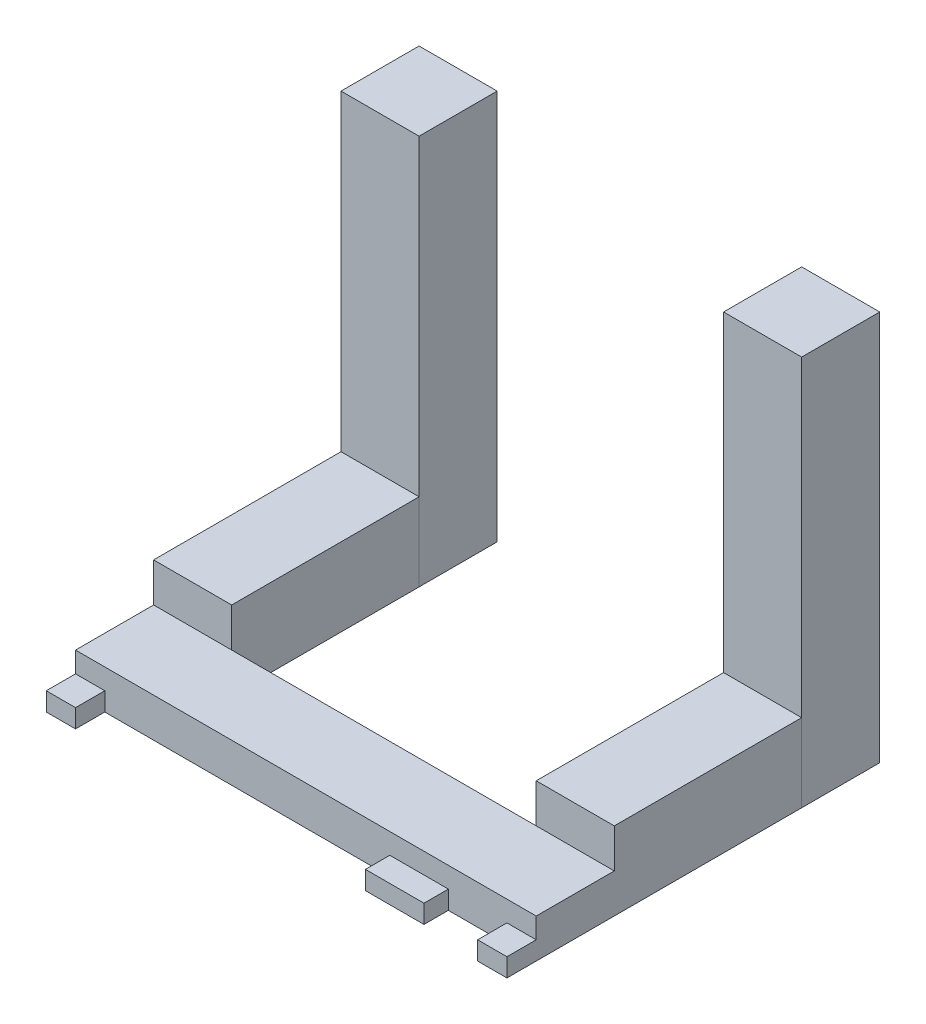
ISO-10303-21;
HEADER;
FILE_DESCRIPTION(('STEP AP214'),'2;1');
FILE_NAME('part.step','',(''),(''),'','','');
FILE_SCHEMA(('AUTOMOTIVE_DESIGN { 1 0 10303 214 1 1 1 1 }'));
ENDSEC;
DATA;
#1=APPLICATION_CONTEXT('core data for automotive mechanical design processes');
#2=APPLICATION_PROTOCOL_DEFINITION('international standard','automotive_design',2000,#1);
#3=PRODUCT_CONTEXT('',#1,'mechanical');
#4=PRODUCT('Part','Part','',(#3));
#5=PRODUCT_RELATED_PRODUCT_CATEGORY('part','',(#4));
#6=PRODUCT_DEFINITION_FORMATION('','',#4);
#7=PRODUCT_DEFINITION_CONTEXT('part definition',#1,'design');
#8=PRODUCT_DEFINITION('design','',#6,#7);
#9=PRODUCT_DEFINITION_SHAPE('','',#8);
#10=(LENGTH_UNIT() NAMED_UNIT(*) SI_UNIT(.MILLI.,.METRE.));
#11=(NAMED_UNIT(*) PLANE_ANGLE_UNIT() SI_UNIT($,.RADIAN.));
#12=(NAMED_UNIT(*) SI_UNIT($,.STERADIAN.) SOLID_ANGLE_UNIT());
#13=UNCERTAINTY_MEASURE_WITH_UNIT(LENGTH_MEASURE(1.E-05),#10,'distance_accuracy_value','');
#14=(GEOMETRIC_REPRESENTATION_CONTEXT(3) GLOBAL_UNCERTAINTY_ASSIGNED_CONTEXT((#13)) GLOBAL_UNIT_ASSIGNED_CONTEXT((#10,
#11,#12)) REPRESENTATION_CONTEXT('',''));
#15=CARTESIAN_POINT('',(0.,0.,0.));
#16=DIRECTION('',(0.,0.,1.));
#17=DIRECTION('',(1.,0.,0.));
#18=AXIS2_PLACEMENT_3D('',#15,#16,#17);
#19=CARTESIAN_POINT('',(0.,0.,43.18));
#20=DIRECTION('',(0.,0.,1.));
#21=DIRECTION('',(1.,0.,0.));
#22=AXIS2_PLACEMENT_3D('',#19,#20,#21);
#23=PLANE('',#22);
#24=DIRECTION('',(0.,-1.,0.));
#25=VECTOR('',#24,1.);
#26=CARTESIAN_POINT('',(-70.1675,0.,43.18));
#27=LINE('',#26,#25);
#28=CARTESIAN_POINT('',(-70.1675,3.,43.18));
#29=VERTEX_POINT('',#28);
#30=CARTESIAN_POINT('',(-70.1675,0.,43.18));
#31=VERTEX_POINT('',#30);
#32=EDGE_CURVE('E76',#29,#31,#27,.T.);
#33=ORIENTED_EDGE('',*,*,#32,.T.);
#34=DIRECTION('',(1.,0.,0.));
#35=VECTOR('',#34,1.);
#36=CARTESIAN_POINT('',(0.,0.,43.18));
#37=LINE('',#36,#35);
#38=CARTESIAN_POINT('',(-23.8125,0.,43.18));
#39=VERTEX_POINT('',#38);
#40=EDGE_CURVE('E212',#31,#39,#37,.T.);
#41=ORIENTED_EDGE('',*,*,#40,.T.);
#42=DIRECTION('',(0.,-1.,0.));
#43=VECTOR('',#42,1.);
#44=CARTESIAN_POINT('',(-23.8125,0.,43.18));
#45=LINE('',#44,#43);
#46=CARTESIAN_POINT('',(-23.8125,3.,43.18));
#47=VERTEX_POINT('',#46);
#48=EDGE_CURVE('E263',#47,#39,#45,.T.);
#49=ORIENTED_EDGE('',*,*,#48,.F.);
#50=DIRECTION('',(-1.,0.,0.));
#51=VECTOR('',#50,1.);
#52=CARTESIAN_POINT('',(-23.8125,3.,43.18));
#53=LINE('',#52,#51);
#54=CARTESIAN_POINT('',(-14.2875,3.,43.18));
#55=VERTEX_POINT('',#54);
#56=EDGE_CURVE('E268',#55,#47,#53,.T.);
#57=ORIENTED_EDGE('',*,*,#56,.F.);
#58=DIRECTION('',(0.,1.,0.));
#59=VECTOR('',#58,1.);
#60=CARTESIAN_POINT('',(-14.2875,0.,43.18));
#61=LINE('',#60,#59);
#62=CARTESIAN_POINT('',(-14.2875,0.,43.18));
#63=VERTEX_POINT('',#62);
#64=EDGE_CURVE('E277',#63,#55,#61,.T.);
#65=ORIENTED_EDGE('',*,*,#64,.F.);
#66=CARTESIAN_POINT('',(-4.7625,0.,43.18));
#67=VERTEX_POINT('',#66);
#68=EDGE_CURVE('E326',#63,#67,#37,.T.);
#69=ORIENTED_EDGE('',*,*,#68,.T.);
#70=DIRECTION('',(0.,-1.,0.));
#71=VECTOR('',#70,1.);
#72=CARTESIAN_POINT('',(-4.7625,0.,43.18));
#73=LINE('',#72,#71);
#74=CARTESIAN_POINT('',(-4.7625,3.,43.18));
#75=VERTEX_POINT('',#74);
#76=EDGE_CURVE('E243',#75,#67,#73,.T.);
#77=ORIENTED_EDGE('',*,*,#76,.F.);
#78=DIRECTION('',(-1.,0.,0.));
#79=VECTOR('',#78,1.);
#80=CARTESIAN_POINT('',(0.,3.,43.18));
#81=LINE('',#80,#79);
#82=CARTESIAN_POINT('',(0.,3.,43.18));
#83=VERTEX_POINT('',#82);
#84=EDGE_CURVE('E238',#83,#75,#81,.T.);
#85=ORIENTED_EDGE('',*,*,#84,.F.);
#86=DIRECTION('',(0.,-1.,0.));
#87=VECTOR('',#86,1.);
#88=CARTESIAN_POINT('',(0.,0.,43.18));
#89=LINE('',#88,#87);
#90=CARTESIAN_POINT('',(0.,6.35,43.18));
#91=VERTEX_POINT('',#90);
#92=EDGE_CURVE('E317',#91,#83,#89,.T.);
#93=ORIENTED_EDGE('',*,*,#92,.F.);
#94=DIRECTION('',(1.,0.,0.));
#95=VECTOR('',#94,1.);
#96=CARTESIAN_POINT('',(0.,6.35,43.18));
#97=LINE('',#96,#95);
#98=CARTESIAN_POINT('',(-74.93,6.35,43.18));
#99=VERTEX_POINT('',#98);
#100=EDGE_CURVE('E320',#99,#91,#97,.T.);
#101=ORIENTED_EDGE('',*,*,#100,.F.);
#102=DIRECTION('',(0.,-1.,0.));
#103=VECTOR('',#102,1.);
#104=CARTESIAN_POINT('',(-74.93,0.,43.18));
#105=LINE('',#104,#103);
#106=CARTESIAN_POINT('',(-74.93,3.,43.18));
#107=VERTEX_POINT('',#106);
#108=EDGE_CURVE('E324',#99,#107,#105,.T.);
#109=ORIENTED_EDGE('',*,*,#108,.T.);
#110=DIRECTION('',(1.,0.,0.));
#111=VECTOR('',#110,1.);
#112=CARTESIAN_POINT('',(-74.93,3.,43.18));
#113=LINE('',#112,#111);
#114=EDGE_CURVE('E71',#107,#29,#113,.T.);
#115=ORIENTED_EDGE('',*,*,#114,.T.);
#116=EDGE_LOOP('',(#33,#41,#49,#57,#65,#69,#77,#85,#93,#101,#109,#115));
#117=FACE_BOUND('',#116,.T.);
#118=ADVANCED_FACE('F52',(#117),#23,.T.);
#119=CARTESIAN_POINT('',(0.,0.,30.48));
#120=DIRECTION('',(0.,0.,1.));
#121=DIRECTION('',(1.,0.,0.));
#122=AXIS2_PLACEMENT_3D('',#119,#120,#121);
#123=PLANE('',#122);
#124=DIRECTION('',(0.,1.,0.));
#125=VECTOR('',#124,1.);
#126=CARTESIAN_POINT('',(-62.23,12.7,30.48));
#127=LINE('',#126,#125);
#128=CARTESIAN_POINT('',(-62.23,0.,30.48));
#129=VERTEX_POINT('',#128);
#130=CARTESIAN_POINT('',(-62.23,6.35,30.48));
#131=VERTEX_POINT('',#130);
#132=EDGE_CURVE('E294',#129,#131,#127,.T.);
#133=ORIENTED_EDGE('',*,*,#132,.T.);
#134=DIRECTION('',(1.,0.,0.));
#135=VECTOR('',#134,1.);
#136=CARTESIAN_POINT('',(0.,6.35,30.48));
#137=LINE('',#136,#135);
#138=CARTESIAN_POINT('',(-12.7,6.35,30.48));
#139=VERTEX_POINT('',#138);
#140=EDGE_CURVE('E64',#131,#139,#137,.T.);
#141=ORIENTED_EDGE('',*,*,#140,.T.);
#142=DIRECTION('',(0.,-1.,0.));
#143=VECTOR('',#142,1.);
#144=CARTESIAN_POINT('',(-12.7,12.7,30.48));
#145=LINE('',#144,#143);
#146=CARTESIAN_POINT('',(-12.7,0.,30.48));
#147=VERTEX_POINT('',#146);
#148=EDGE_CURVE('E354',#139,#147,#145,.T.);
#149=ORIENTED_EDGE('',*,*,#148,.T.);
#150=DIRECTION('',(1.,0.,0.));
#151=VECTOR('',#150,1.);
#152=CARTESIAN_POINT('',(0.,0.,30.48));
#153=LINE('',#152,#151);
#154=EDGE_CURVE('E321',#129,#147,#153,.T.);
#155=ORIENTED_EDGE('',*,*,#154,.F.);
#156=EDGE_LOOP('',(#133,#141,#149,#155));
#157=FACE_BOUND('',#156,.T.);
#158=ADVANCED_FACE('F372',(#157),#123,.F.);
#159=CARTESIAN_POINT('',(0.,0.,30.48));
#160=DIRECTION('',(0.,0.,1.));
#161=DIRECTION('',(1.,0.,0.));
#162=AXIS2_PLACEMENT_3D('',#159,#160,#161);
#163=PLANE('',#162);
#164=CARTESIAN_POINT('',(-12.7,12.7,30.48));
#165=VERTEX_POINT('',#164);
#166=EDGE_CURVE('E56',#165,#139,#145,.T.);
#167=ORIENTED_EDGE('',*,*,#166,.T.);
#168=CARTESIAN_POINT('',(0.,6.35,30.48));
#169=VERTEX_POINT('',#168);
#170=EDGE_CURVE('E12',#139,#169,#137,.T.);
#171=ORIENTED_EDGE('',*,*,#170,.T.);
#172=DIRECTION('',(0.,1.,0.));
#173=VECTOR('',#172,1.);
#174=CARTESIAN_POINT('',(0.,12.7,30.48));
#175=LINE('',#174,#173);
#176=CARTESIAN_POINT('',(0.,12.7,30.48));
#177=VERTEX_POINT('',#176);
#178=EDGE_CURVE('E353',#169,#177,#175,.T.);
#179=ORIENTED_EDGE('',*,*,#178,.T.);
#180=DIRECTION('',(-1.,0.,0.));
#181=VECTOR('',#180,1.);
#182=CARTESIAN_POINT('',(-12.7,12.7,30.48));
#183=LINE('',#182,#181);
#184=EDGE_CURVE('E344',#177,#165,#183,.T.);
#185=ORIENTED_EDGE('',*,*,#184,.T.);
#186=EDGE_LOOP('',(#167,#171,#179,#185));
#187=FACE_BOUND('',#186,.T.);
#188=ADVANCED_FACE('F54',(#187),#163,.T.);
#189=CARTESIAN_POINT('',(-12.7,12.7,30.48));
#190=DIRECTION('',(1.,0.,0.));
#191=DIRECTION('',(0.,1.,0.));
#192=AXIS2_PLACEMENT_3D('',#189,#190,#191);
#193=PLANE('',#192);
#194=DIRECTION('',(0.,-1.,0.));
#195=VECTOR('',#194,1.);
#196=CARTESIAN_POINT('',(-12.7,12.7,0.));
#197=LINE('',#196,#195);
#198=CARTESIAN_POINT('',(-12.7,12.7,0.));
#199=VERTEX_POINT('',#198);
#200=CARTESIAN_POINT('',(-12.7,0.,0.));
#201=VERTEX_POINT('',#200);
#202=EDGE_CURVE('E61',#199,#201,#197,.T.);
#203=ORIENTED_EDGE('',*,*,#202,.T.);
#204=DIRECTION('',(0.,0.,-1.));
#205=VECTOR('',#204,1.);
#206=CARTESIAN_POINT('',(-12.7,0.,30.48));
#207=LINE('',#206,#205);
#208=EDGE_CURVE('E332',#147,#201,#207,.T.);
#209=ORIENTED_EDGE('',*,*,#208,.F.);
#210=ORIENTED_EDGE('',*,*,#148,.F.);
#211=ORIENTED_EDGE('',*,*,#166,.F.);
#212=DIRECTION('',(0.,0.,-1.));
#213=VECTOR('',#212,1.);
#214=CARTESIAN_POINT('',(-12.7,12.7,30.48));
#215=LINE('',#214,#213);
#216=EDGE_CURVE('E341',#165,#199,#215,.T.);
#217=ORIENTED_EDGE('',*,*,#216,.T.);
#218=EDGE_LOOP('',(#203,#209,#210,#211,#217));
#219=FACE_BOUND('',#218,.T.);
#220=ADVANCED_FACE('F369',(#219),#193,.F.);
#221=CARTESIAN_POINT('',(-12.7,0.,30.48));
#222=DIRECTION('',(0.,1.,0.));
#223=DIRECTION('',(0.,0.,1.));
#224=AXIS2_PLACEMENT_3D('',#221,#222,#223);
#225=PLANE('',#224);
#226=DIRECTION('',(1.,0.,0.));
#227=VECTOR('',#226,1.);
#228=CARTESIAN_POINT('',(-12.7,0.,0.));
#229=LINE('',#228,#227);
#230=CARTESIAN_POINT('',(0.,0.,0.));
#231=VERTEX_POINT('',#230);
#232=EDGE_CURVE('E349',#201,#231,#229,.T.);
#233=ORIENTED_EDGE('',*,*,#232,.T.);
#234=DIRECTION('',(0.,0.,-1.));
#235=VECTOR('',#234,1.);
#236=CARTESIAN_POINT('',(0.,0.,30.48));
#237=LINE('',#236,#235);
#238=CARTESIAN_POINT('',(0.,0.,47.9425));
#239=VERTEX_POINT('',#238);
#240=EDGE_CURVE('E335',#239,#231,#237,.T.);
#241=ORIENTED_EDGE('',*,*,#240,.F.);
#242=DIRECTION('',(1.,0.,0.));
#243=VECTOR('',#242,1.);
#244=CARTESIAN_POINT('',(0.,0.,47.9425));
#245=LINE('',#244,#243);
#246=CARTESIAN_POINT('',(-4.7625,0.,47.9425));
#247=VERTEX_POINT('',#246);
#248=EDGE_CURVE('E247',#247,#239,#245,.T.);
#249=ORIENTED_EDGE('',*,*,#248,.F.);
#250=DIRECTION('',(0.,0.,-1.));
#251=VECTOR('',#250,1.);
#252=CARTESIAN_POINT('',(-4.7625,0.,47.9425));
#253=LINE('',#252,#251);
#254=EDGE_CURVE('E250',#247,#67,#253,.T.);
#255=ORIENTED_EDGE('',*,*,#254,.T.);
#256=ORIENTED_EDGE('',*,*,#68,.F.);
#257=DIRECTION('',(0.,0.,-1.));
#258=VECTOR('',#257,1.);
#259=CARTESIAN_POINT('',(-14.2875,0.,47.14875));
#260=LINE('',#259,#258);
#261=CARTESIAN_POINT('',(-14.2875,0.,47.14875));
#262=VERTEX_POINT('',#261);
#263=EDGE_CURVE('E287',#262,#63,#260,.T.);
#264=ORIENTED_EDGE('',*,*,#263,.F.);
#265=DIRECTION('',(1.,0.,0.));
#266=VECTOR('',#265,1.);
#267=CARTESIAN_POINT('',(-23.8125,0.,47.14875));
#268=LINE('',#267,#266);
#269=CARTESIAN_POINT('',(-23.8125,0.,47.14875));
#270=VERTEX_POINT('',#269);
#271=EDGE_CURVE('E267',#270,#262,#268,.T.);
#272=ORIENTED_EDGE('',*,*,#271,.F.);
#273=DIRECTION('',(0.,0.,-1.));
#274=VECTOR('',#273,1.);
#275=CARTESIAN_POINT('',(-23.8125,0.,47.14875));
#276=LINE('',#275,#274);
#277=EDGE_CURVE('E290',#270,#39,#276,.T.);
#278=ORIENTED_EDGE('',*,*,#277,.T.);
#279=ORIENTED_EDGE('',*,*,#40,.F.);
#280=DIRECTION('',(0.,0.,-1.));
#281=VECTOR('',#280,1.);
#282=CARTESIAN_POINT('',(-70.1675,0.,47.9425));
#283=LINE('',#282,#281);
#284=CARTESIAN_POINT('',(-70.1675,0.,47.9425));
#285=VERTEX_POINT('',#284);
#286=EDGE_CURVE('E225',#285,#31,#283,.T.);
#287=ORIENTED_EDGE('',*,*,#286,.F.);
#288=DIRECTION('',(-1.,0.,0.));
#289=VECTOR('',#288,1.);
#290=CARTESIAN_POINT('',(-74.93,0.,47.9425));
#291=LINE('',#290,#289);
#292=CARTESIAN_POINT('',(-74.93,0.,47.9425));
#293=VERTEX_POINT('',#292);
#294=EDGE_CURVE('E218',#285,#293,#291,.T.);
#295=ORIENTED_EDGE('',*,*,#294,.T.);
#296=DIRECTION('',(0.,0.,-1.));
#297=VECTOR('',#296,1.);
#298=CARTESIAN_POINT('',(-74.93,0.,43.18));
#299=LINE('',#298,#297);
#300=CARTESIAN_POINT('',(-74.93,0.,0.));
#301=VERTEX_POINT('',#300);
#302=EDGE_CURVE('E198',#293,#301,#299,.T.);
#303=ORIENTED_EDGE('',*,*,#302,.T.);
#304=DIRECTION('',(1.,0.,0.));
#305=VECTOR('',#304,1.);
#306=CARTESIAN_POINT('',(-62.23,0.,0.));
#307=LINE('',#306,#305);
#308=CARTESIAN_POINT('',(-62.23,0.,0.));
#309=VERTEX_POINT('',#308);
#310=EDGE_CURVE('E308',#301,#309,#307,.T.);
#311=ORIENTED_EDGE('',*,*,#310,.T.);
#312=DIRECTION('',(0.,0.,-1.));
#313=VECTOR('',#312,1.);
#314=CARTESIAN_POINT('',(-62.23,0.,30.48));
#315=LINE('',#314,#313);
#316=EDGE_CURVE('E302',#129,#309,#315,.T.);
#317=ORIENTED_EDGE('',*,*,#316,.F.);
#318=ORIENTED_EDGE('',*,*,#154,.T.);
#319=ORIENTED_EDGE('',*,*,#208,.T.);
#320=EDGE_LOOP('',(#233,#241,#249,#255,#256,#264,#272,#278,#279,#287,#295,#303,#311,#317,#318,#319));
#321=FACE_BOUND('',#320,.T.);
#322=ADVANCED_FACE('F223',(#321),#225,.F.);
#323=CARTESIAN_POINT('',(0.,12.7,30.48));
#324=DIRECTION('',(-1.,0.,0.));
#325=DIRECTION('',(0.,0.,1.));
#326=AXIS2_PLACEMENT_3D('',#323,#324,#325);
#327=PLANE('',#326);
#328=DIRECTION('',(0.,1.,0.));
#329=VECTOR('',#328,1.);
#330=CARTESIAN_POINT('',(0.,12.7,0.));
#331=LINE('',#330,#329);
#332=CARTESIAN_POINT('',(0.,12.7,0.));
#333=VERTEX_POINT('',#332);
#334=EDGE_CURVE('E347',#231,#333,#331,.T.);
#335=ORIENTED_EDGE('',*,*,#334,.T.);
#336=DIRECTION('',(0.,0.,-1.));
#337=VECTOR('',#336,1.);
#338=CARTESIAN_POINT('',(0.,12.7,30.48));
#339=LINE('',#338,#337);
#340=EDGE_CURVE('E338',#177,#333,#339,.T.);
#341=ORIENTED_EDGE('',*,*,#340,.F.);
#342=ORIENTED_EDGE('',*,*,#178,.F.);
#343=DIRECTION('',(0.,0.,-1.));
#344=VECTOR('',#343,1.);
#345=CARTESIAN_POINT('',(0.,6.35,43.18));
#346=LINE('',#345,#344);
#347=EDGE_CURVE('E330',#91,#169,#346,.T.);
#348=ORIENTED_EDGE('',*,*,#347,.F.);
#349=ORIENTED_EDGE('',*,*,#92,.T.);
#350=DIRECTION('',(0.,0.,-1.));
#351=VECTOR('',#350,1.);
#352=CARTESIAN_POINT('',(0.,3.,47.9425));
#353=LINE('',#352,#351);
#354=CARTESIAN_POINT('',(0.,3.,47.9425));
#355=VERTEX_POINT('',#354);
#356=EDGE_CURVE('E260',#355,#83,#353,.T.);
#357=ORIENTED_EDGE('',*,*,#356,.F.);
#358=DIRECTION('',(0.,1.,0.));
#359=VECTOR('',#358,1.);
#360=CARTESIAN_POINT('',(0.,0.,47.9425));
#361=LINE('',#360,#359);
#362=EDGE_CURVE('E239',#239,#355,#361,.T.);
#363=ORIENTED_EDGE('',*,*,#362,.F.);
#364=ORIENTED_EDGE('',*,*,#240,.T.);
#365=EDGE_LOOP('',(#335,#341,#342,#348,#349,#357,#363,#364));
#366=FACE_BOUND('',#365,.T.);
#367=ADVANCED_FACE('F382',(#366),#327,.F.);
#368=CARTESIAN_POINT('',(-12.7,12.7,30.48));
#369=DIRECTION('',(0.,-1.,0.));
#370=DIRECTION('',(0.,0.,-1.));
#371=AXIS2_PLACEMENT_3D('',#368,#369,#370);
#372=PLANE('',#371);
#373=DIRECTION('',(-1.,0.,0.));
#374=VECTOR('',#373,1.);
#375=CARTESIAN_POINT('',(-12.7,12.7,0.));
#376=LINE('',#375,#374);
#377=EDGE_CURVE('E345',#333,#199,#376,.T.);
#378=ORIENTED_EDGE('',*,*,#377,.T.);
#379=ORIENTED_EDGE('',*,*,#216,.F.);
#380=ORIENTED_EDGE('',*,*,#184,.F.);
#381=ORIENTED_EDGE('',*,*,#340,.T.);
#382=EDGE_LOOP('',(#378,#379,#380,#381));
#383=FACE_BOUND('',#382,.T.);
#384=ADVANCED_FACE('F400',(#383),#372,.F.);
#385=CARTESIAN_POINT('',(0.,0.,0.));
#386=DIRECTION('',(0.,0.,1.));
#387=DIRECTION('',(1.,0.,0.));
#388=AXIS2_PLACEMENT_3D('',#385,#386,#387);
#389=PLANE('',#388);
#390=ORIENTED_EDGE('',*,*,#202,.F.);
#391=ORIENTED_EDGE('',*,*,#377,.F.);
#392=ORIENTED_EDGE('',*,*,#334,.F.);
#393=ORIENTED_EDGE('',*,*,#232,.F.);
#394=EDGE_LOOP('',(#390,#391,#392,#393));
#395=FACE_BOUND('',#394,.T.);
#396=ADVANCED_FACE('F398',(#395),#389,.F.);
#397=CARTESIAN_POINT('',(0.,6.35,43.18));
#398=DIRECTION('',(0.,1.,0.));
#399=DIRECTION('',(0.,0.,1.));
#400=AXIS2_PLACEMENT_3D('',#397,#398,#399);
#401=PLANE('',#400);
#402=CARTESIAN_POINT('',(-74.93,6.35,30.48));
#403=VERTEX_POINT('',#402);
#404=EDGE_CURVE('E63',#403,#131,#137,.T.);
#405=ORIENTED_EDGE('',*,*,#404,.F.);
#406=DIRECTION('',(0.,0.,-1.));
#407=VECTOR('',#406,1.);
#408=CARTESIAN_POINT('',(-74.93,6.35,43.18));
#409=LINE('',#408,#407);
#410=EDGE_CURVE('E211',#99,#403,#409,.T.);
#411=ORIENTED_EDGE('',*,*,#410,.F.);
#412=ORIENTED_EDGE('',*,*,#100,.T.);
#413=ORIENTED_EDGE('',*,*,#347,.T.);
#414=ORIENTED_EDGE('',*,*,#170,.F.);
#415=ORIENTED_EDGE('',*,*,#140,.F.);
#416=EDGE_LOOP('',(#405,#411,#412,#413,#414,#415));
#417=FACE_BOUND('',#416,.T.);
#418=ADVANCED_FACE('F378',(#417),#401,.T.);
#419=CARTESIAN_POINT('',(-74.93,0.,43.18));
#420=DIRECTION('',(1.,0.,0.));
#421=DIRECTION('',(0.,0.,-1.));
#422=AXIS2_PLACEMENT_3D('',#419,#420,#421);
#423=PLANE('',#422);
#424=ORIENTED_EDGE('',*,*,#410,.T.);
#425=DIRECTION('',(0.,-1.,0.));
#426=VECTOR('',#425,1.);
#427=CARTESIAN_POINT('',(-74.93,12.7,30.48));
#428=LINE('',#427,#426);
#429=CARTESIAN_POINT('',(-74.93,12.7,30.48));
#430=VERTEX_POINT('',#429);
#431=EDGE_CURVE('E300',#430,#403,#428,.T.);
#432=ORIENTED_EDGE('',*,*,#431,.F.);
#433=DIRECTION('',(0.,0.,-1.));
#434=VECTOR('',#433,1.);
#435=CARTESIAN_POINT('',(-74.93,12.7,30.48));
#436=LINE('',#435,#434);
#437=CARTESIAN_POINT('',(-74.93,12.7,0.));
#438=VERTEX_POINT('',#437);
#439=EDGE_CURVE('E312',#430,#438,#436,.T.);
#440=ORIENTED_EDGE('',*,*,#439,.T.);
#441=DIRECTION('',(0.,-1.,0.));
#442=VECTOR('',#441,1.);
#443=CARTESIAN_POINT('',(-74.93,12.7,0.));
#444=LINE('',#443,#442);
#445=EDGE_CURVE('E207',#438,#301,#444,.T.);
#446=ORIENTED_EDGE('',*,*,#445,.T.);
#447=ORIENTED_EDGE('',*,*,#302,.F.);
#448=DIRECTION('',(0.,1.,0.));
#449=VECTOR('',#448,1.);
#450=CARTESIAN_POINT('',(-74.93,0.,47.9425));
#451=LINE('',#450,#449);
#452=CARTESIAN_POINT('',(-74.93,3.,47.9425));
#453=VERTEX_POINT('',#452);
#454=EDGE_CURVE('E203',#293,#453,#451,.T.);
#455=ORIENTED_EDGE('',*,*,#454,.T.);
#456=DIRECTION('',(0.,0.,-1.));
#457=VECTOR('',#456,1.);
#458=CARTESIAN_POINT('',(-74.93,3.,47.9425));
#459=LINE('',#458,#457);
#460=EDGE_CURVE('E231',#453,#107,#459,.T.);
#461=ORIENTED_EDGE('',*,*,#460,.T.);
#462=ORIENTED_EDGE('',*,*,#108,.F.);
#463=EDGE_LOOP('',(#424,#432,#440,#446,#447,#455,#461,#462));
#464=FACE_BOUND('',#463,.T.);
#465=ADVANCED_FACE('F201',(#464),#423,.F.);
#466=CARTESIAN_POINT('',(-62.23,12.7,30.48));
#467=DIRECTION('',(-1.,0.,0.));
#468=DIRECTION('',(0.,0.,1.));
#469=AXIS2_PLACEMENT_3D('',#466,#467,#468);
#470=PLANE('',#469);
#471=DIRECTION('',(0.,1.,0.));
#472=VECTOR('',#471,1.);
#473=CARTESIAN_POINT('',(-62.23,12.7,0.));
#474=LINE('',#473,#472);
#475=CARTESIAN_POINT('',(-62.23,12.7,0.));
#476=VERTEX_POINT('',#475);
#477=EDGE_CURVE('E293',#309,#476,#474,.T.);
#478=ORIENTED_EDGE('',*,*,#477,.T.);
#479=DIRECTION('',(0.,0.,-1.));
#480=VECTOR('',#479,1.);
#481=CARTESIAN_POINT('',(-62.23,12.7,30.48));
#482=LINE('',#481,#480);
#483=CARTESIAN_POINT('',(-62.23,12.7,30.48));
#484=VERTEX_POINT('',#483);
#485=EDGE_CURVE('E314',#484,#476,#482,.T.);
#486=ORIENTED_EDGE('',*,*,#485,.F.);
#487=EDGE_CURVE('E298',#131,#484,#127,.T.);
#488=ORIENTED_EDGE('',*,*,#487,.F.);
#489=ORIENTED_EDGE('',*,*,#132,.F.);
#490=ORIENTED_EDGE('',*,*,#316,.T.);
#491=EDGE_LOOP('',(#478,#486,#488,#489,#490));
#492=FACE_BOUND('',#491,.T.);
#493=ADVANCED_FACE('F415',(#492),#470,.F.);
#494=CARTESIAN_POINT('',(-62.23,12.7,30.48));
#495=DIRECTION('',(0.,-1.,0.));
#496=DIRECTION('',(1.,0.,0.));
#497=AXIS2_PLACEMENT_3D('',#494,#495,#496);
#498=PLANE('',#497);
#499=DIRECTION('',(-1.,0.,0.));
#500=VECTOR('',#499,1.);
#501=CARTESIAN_POINT('',(-62.23,12.7,0.));
#502=LINE('',#501,#500);
#503=EDGE_CURVE('E305',#476,#438,#502,.T.);
#504=ORIENTED_EDGE('',*,*,#503,.T.);
#505=ORIENTED_EDGE('',*,*,#439,.F.);
#506=DIRECTION('',(-1.,0.,0.));
#507=VECTOR('',#506,1.);
#508=CARTESIAN_POINT('',(-62.23,12.7,30.48));
#509=LINE('',#508,#507);
#510=EDGE_CURVE('E297',#484,#430,#509,.T.);
#511=ORIENTED_EDGE('',*,*,#510,.F.);
#512=ORIENTED_EDGE('',*,*,#485,.T.);
#513=EDGE_LOOP('',(#504,#505,#511,#512));
#514=FACE_BOUND('',#513,.T.);
#515=ADVANCED_FACE('F533',(#514),#498,.F.);
#516=CARTESIAN_POINT('',(0.,0.,30.48));
#517=DIRECTION('',(0.,0.,-1.));
#518=DIRECTION('',(-1.,0.,0.));
#519=AXIS2_PLACEMENT_3D('',#516,#517,#518);
#520=PLANE('',#519);
#521=ORIENTED_EDGE('',*,*,#404,.T.);
#522=ORIENTED_EDGE('',*,*,#487,.T.);
#523=ORIENTED_EDGE('',*,*,#510,.T.);
#524=ORIENTED_EDGE('',*,*,#431,.T.);
#525=EDGE_LOOP('',(#521,#522,#523,#524));
#526=FACE_BOUND('',#525,.T.);
#527=ADVANCED_FACE('F539',(#526),#520,.F.);
#528=CARTESIAN_POINT('',(0.,0.,0.));
#529=DIRECTION('',(0.,0.,-1.));
#530=DIRECTION('',(-1.,0.,0.));
#531=AXIS2_PLACEMENT_3D('',#528,#529,#530);
#532=PLANE('',#531);
#533=ORIENTED_EDGE('',*,*,#477,.F.);
#534=ORIENTED_EDGE('',*,*,#310,.F.);
#535=ORIENTED_EDGE('',*,*,#445,.F.);
#536=ORIENTED_EDGE('',*,*,#503,.F.);
#537=EDGE_LOOP('',(#533,#534,#535,#536));
#538=FACE_BOUND('',#537,.T.);
#539=ADVANCED_FACE('F546',(#538),#532,.T.);
#540=CARTESIAN_POINT('',(-23.8125,0.,47.14875));
#541=DIRECTION('',(1.,0.,0.));
#542=DIRECTION('',(0.,0.,-1.));
#543=AXIS2_PLACEMENT_3D('',#540,#541,#542);
#544=PLANE('',#543);
#545=ORIENTED_EDGE('',*,*,#48,.T.);
#546=ORIENTED_EDGE('',*,*,#277,.F.);
#547=DIRECTION('',(0.,-1.,0.));
#548=VECTOR('',#547,1.);
#549=CARTESIAN_POINT('',(-23.8125,0.,47.14875));
#550=LINE('',#549,#548);
#551=CARTESIAN_POINT('',(-23.8125,3.,47.14875));
#552=VERTEX_POINT('',#551);
#553=EDGE_CURVE('E264',#552,#270,#550,.T.);
#554=ORIENTED_EDGE('',*,*,#553,.F.);
#555=DIRECTION('',(0.,0.,-1.));
#556=VECTOR('',#555,1.);
#557=CARTESIAN_POINT('',(-23.8125,3.,47.14875));
#558=LINE('',#557,#556);
#559=EDGE_CURVE('E274',#552,#47,#558,.T.);
#560=ORIENTED_EDGE('',*,*,#559,.T.);
#561=EDGE_LOOP('',(#545,#546,#554,#560));
#562=FACE_BOUND('',#561,.T.);
#563=ADVANCED_FACE('F554',(#562),#544,.F.);
#564=CARTESIAN_POINT('',(-14.2875,0.,47.14875));
#565=DIRECTION('',(-1.,0.,0.));
#566=DIRECTION('',(0.,0.,1.));
#567=AXIS2_PLACEMENT_3D('',#564,#565,#566);
#568=PLANE('',#567);
#569=ORIENTED_EDGE('',*,*,#64,.T.);
#570=DIRECTION('',(0.,0.,-1.));
#571=VECTOR('',#570,1.);
#572=CARTESIAN_POINT('',(-14.2875,3.,47.14875));
#573=LINE('',#572,#571);
#574=CARTESIAN_POINT('',(-14.2875,3.,47.14875));
#575=VERTEX_POINT('',#574);
#576=EDGE_CURVE('E284',#575,#55,#573,.T.);
#577=ORIENTED_EDGE('',*,*,#576,.F.);
#578=DIRECTION('',(0.,1.,0.));
#579=VECTOR('',#578,1.);
#580=CARTESIAN_POINT('',(-14.2875,0.,47.14875));
#581=LINE('',#580,#579);
#582=EDGE_CURVE('E270',#262,#575,#581,.T.);
#583=ORIENTED_EDGE('',*,*,#582,.F.);
#584=ORIENTED_EDGE('',*,*,#263,.T.);
#585=EDGE_LOOP('',(#569,#577,#583,#584));
#586=FACE_BOUND('',#585,.T.);
#587=ADVANCED_FACE('F562',(#586),#568,.F.);
#588=CARTESIAN_POINT('',(-23.8125,3.,47.14875));
#589=DIRECTION('',(0.,-1.,0.));
#590=DIRECTION('',(0.,0.,-1.));
#591=AXIS2_PLACEMENT_3D('',#588,#589,#590);
#592=PLANE('',#591);
#593=ORIENTED_EDGE('',*,*,#56,.T.);
#594=ORIENTED_EDGE('',*,*,#559,.F.);
#595=DIRECTION('',(-1.,0.,0.));
#596=VECTOR('',#595,1.);
#597=CARTESIAN_POINT('',(-23.8125,3.,47.14875));
#598=LINE('',#597,#596);
#599=EDGE_CURVE('E272',#575,#552,#598,.T.);
#600=ORIENTED_EDGE('',*,*,#599,.F.);
#601=ORIENTED_EDGE('',*,*,#576,.T.);
#602=EDGE_LOOP('',(#593,#594,#600,#601));
#603=FACE_BOUND('',#602,.T.);
#604=ADVANCED_FACE('F570',(#603),#592,.F.);
#605=CARTESIAN_POINT('',(0.,0.,47.14875));
#606=DIRECTION('',(0.,0.,-1.));
#607=DIRECTION('',(-1.,0.,0.));
#608=AXIS2_PLACEMENT_3D('',#605,#606,#607);
#609=PLANE('',#608);
#610=ORIENTED_EDGE('',*,*,#553,.T.);
#611=ORIENTED_EDGE('',*,*,#271,.T.);
#612=ORIENTED_EDGE('',*,*,#582,.T.);
#613=ORIENTED_EDGE('',*,*,#599,.T.);
#614=EDGE_LOOP('',(#610,#611,#612,#613));
#615=FACE_BOUND('',#614,.T.);
#616=ADVANCED_FACE('F444',(#615),#609,.F.);
#617=CARTESIAN_POINT('',(0.,3.,47.9425));
#618=DIRECTION('',(0.,-1.,0.));
#619=DIRECTION('',(1.,0.,0.));
#620=AXIS2_PLACEMENT_3D('',#617,#618,#619);
#621=PLANE('',#620);
#622=ORIENTED_EDGE('',*,*,#84,.T.);
#623=DIRECTION('',(0.,0.,-1.));
#624=VECTOR('',#623,1.);
#625=CARTESIAN_POINT('',(-4.7625,3.,47.9425));
#626=LINE('',#625,#624);
#627=CARTESIAN_POINT('',(-4.7625,3.,47.9425));
#628=VERTEX_POINT('',#627);
#629=EDGE_CURVE('E257',#628,#75,#626,.T.);
#630=ORIENTED_EDGE('',*,*,#629,.F.);
#631=DIRECTION('',(-1.,0.,0.));
#632=VECTOR('',#631,1.);
#633=CARTESIAN_POINT('',(0.,3.,47.9425));
#634=LINE('',#633,#632);
#635=EDGE_CURVE('E242',#355,#628,#634,.T.);
#636=ORIENTED_EDGE('',*,*,#635,.F.);
#637=ORIENTED_EDGE('',*,*,#356,.T.);
#638=EDGE_LOOP('',(#622,#630,#636,#637));
#639=FACE_BOUND('',#638,.T.);
#640=ADVANCED_FACE('F386',(#639),#621,.F.);
#641=CARTESIAN_POINT('',(-4.7625,0.,47.9425));
#642=DIRECTION('',(1.,0.,0.));
#643=DIRECTION('',(0.,0.,-1.));
#644=AXIS2_PLACEMENT_3D('',#641,#642,#643);
#645=PLANE('',#644);
#646=ORIENTED_EDGE('',*,*,#76,.T.);
#647=ORIENTED_EDGE('',*,*,#254,.F.);
#648=DIRECTION('',(0.,-1.,0.));
#649=VECTOR('',#648,1.);
#650=CARTESIAN_POINT('',(-4.7625,0.,47.9425));
#651=LINE('',#650,#649);
#652=EDGE_CURVE('E245',#628,#247,#651,.T.);
#653=ORIENTED_EDGE('',*,*,#652,.F.);
#654=ORIENTED_EDGE('',*,*,#629,.T.);
#655=EDGE_LOOP('',(#646,#647,#653,#654));
#656=FACE_BOUND('',#655,.T.);
#657=ADVANCED_FACE('F389',(#656),#645,.F.);
#658=CARTESIAN_POINT('',(0.,0.,47.9425));
#659=DIRECTION('',(0.,0.,1.));
#660=DIRECTION('',(1.,0.,0.));
#661=AXIS2_PLACEMENT_3D('',#658,#659,#660);
#662=PLANE('',#661);
#663=ORIENTED_EDGE('',*,*,#362,.T.);
#664=ORIENTED_EDGE('',*,*,#635,.T.);
#665=ORIENTED_EDGE('',*,*,#652,.T.);
#666=ORIENTED_EDGE('',*,*,#248,.T.);
#667=EDGE_LOOP('',(#663,#664,#665,#666));
#668=FACE_BOUND('',#667,.T.);
#669=ADVANCED_FACE('F393',(#668),#662,.T.);
#670=CARTESIAN_POINT('',(-70.1675,0.,47.9425));
#671=DIRECTION('',(1.,0.,0.));
#672=DIRECTION('',(0.,0.,-1.));
#673=AXIS2_PLACEMENT_3D('',#670,#671,#672);
#674=PLANE('',#673);
#675=ORIENTED_EDGE('',*,*,#32,.F.);
#676=DIRECTION('',(0.,0.,-1.));
#677=VECTOR('',#676,1.);
#678=CARTESIAN_POINT('',(-70.1675,3.,47.9425));
#679=LINE('',#678,#677);
#680=CARTESIAN_POINT('',(-70.1675,3.,47.9425));
#681=VERTEX_POINT('',#680);
#682=EDGE_CURVE('E235',#681,#29,#679,.T.);
#683=ORIENTED_EDGE('',*,*,#682,.F.);
#684=DIRECTION('',(0.,-1.,0.));
#685=VECTOR('',#684,1.);
#686=CARTESIAN_POINT('',(-70.1675,0.,47.9425));
#687=LINE('',#686,#685);
#688=EDGE_CURVE('E226',#681,#285,#687,.T.);
#689=ORIENTED_EDGE('',*,*,#688,.T.);
#690=ORIENTED_EDGE('',*,*,#286,.T.);
#691=EDGE_LOOP('',(#675,#683,#689,#690));
#692=FACE_BOUND('',#691,.T.);
#693=ADVANCED_FACE('F469',(#692),#674,.T.);
#694=CARTESIAN_POINT('',(-74.93,3.,47.9425));
#695=DIRECTION('',(0.,1.,0.));
#696=DIRECTION('',(-1.,0.,0.));
#697=AXIS2_PLACEMENT_3D('',#694,#695,#696);
#698=PLANE('',#697);
#699=ORIENTED_EDGE('',*,*,#114,.F.);
#700=ORIENTED_EDGE('',*,*,#460,.F.);
#701=DIRECTION('',(1.,0.,0.));
#702=VECTOR('',#701,1.);
#703=CARTESIAN_POINT('',(-74.93,3.,47.9425));
#704=LINE('',#703,#702);
#705=EDGE_CURVE('E221',#453,#681,#704,.T.);
#706=ORIENTED_EDGE('',*,*,#705,.T.);
#707=ORIENTED_EDGE('',*,*,#682,.T.);
#708=EDGE_LOOP('',(#699,#700,#706,#707));
#709=FACE_BOUND('',#708,.T.);
#710=ADVANCED_FACE('F493',(#709),#698,.T.);
#711=CARTESIAN_POINT('',(-74.93,0.,47.9425));
#712=DIRECTION('',(0.,0.,1.));
#713=DIRECTION('',(-1.,0.,0.));
#714=AXIS2_PLACEMENT_3D('',#711,#712,#713);
#715=PLANE('',#714);
#716=ORIENTED_EDGE('',*,*,#454,.F.);
#717=ORIENTED_EDGE('',*,*,#294,.F.);
#718=ORIENTED_EDGE('',*,*,#688,.F.);
#719=ORIENTED_EDGE('',*,*,#705,.F.);
#720=EDGE_LOOP('',(#716,#717,#718,#719));
#721=FACE_BOUND('',#720,.T.);
#722=ADVANCED_FACE('F216',(#721),#715,.T.);
#723=CLOSED_SHELL('',(#118,#158,#188,#220,#322,#367,#384,#396,#418,#465,#493,#515,#527,#539,
#563,#587,#604,#616,#640,#657,#669,#693,#710,#722));
#724=MANIFOLD_SOLID_BREP('B2',#723);
#725=CARTESIAN_POINT('',(-12.7,63.5,0.));
#726=DIRECTION('',(-1.,0.,0.));
#727=DIRECTION('',(0.,0.,1.));
#728=AXIS2_PLACEMENT_3D('',#725,#726,#727);
#729=PLANE('',#728);
#730=DIRECTION('',(0.,0.,-1.));
#731=VECTOR('',#730,1.);
#732=CARTESIAN_POINT('',(-12.7,0.,0.));
#733=LINE('',#732,#731);
#734=CARTESIAN_POINT('',(-12.7,0.,0.));
#735=VERTEX_POINT('',#734);
#736=CARTESIAN_POINT('',(-12.7,0.,-12.7));
#737=VERTEX_POINT('',#736);
#738=EDGE_CURVE('E786',#735,#737,#733,.T.);
#739=ORIENTED_EDGE('',*,*,#738,.F.);
#740=DIRECTION('',(0.,-1.,0.));
#741=VECTOR('',#740,1.);
#742=CARTESIAN_POINT('',(-12.7,63.5,0.));
#743=LINE('',#742,#741);
#744=CARTESIAN_POINT('',(-12.7,63.5,0.));
#745=VERTEX_POINT('',#744);
#746=EDGE_CURVE('E50',#745,#735,#743,.T.);
#747=ORIENTED_EDGE('',*,*,#746,.F.);
#748=DIRECTION('',(0.,0.,-1.));
#749=VECTOR('',#748,1.);
#750=CARTESIAN_POINT('',(-12.7,63.5,0.));
#751=LINE('',#750,#749);
#752=CARTESIAN_POINT('',(-12.7,63.5,-12.7));
#753=VERTEX_POINT('',#752);
#754=EDGE_CURVE('E780',#745,#753,#751,.T.);
#755=ORIENTED_EDGE('',*,*,#754,.T.);
#756=DIRECTION('',(0.,-1.,0.));
#757=VECTOR('',#756,1.);
#758=CARTESIAN_POINT('',(-12.7,63.5,-12.7));
#759=LINE('',#758,#757);
#760=EDGE_CURVE('E761',#753,#737,#759,.T.);
#761=ORIENTED_EDGE('',*,*,#760,.T.);
#762=EDGE_LOOP('',(#739,#747,#755,#761));
#763=FACE_BOUND('',#762,.T.);
#764=ADVANCED_FACE('F723',(#763),#729,.T.);
#765=CARTESIAN_POINT('',(0.,63.5,0.));
#766=DIRECTION('',(0.,0.,1.));
#767=DIRECTION('',(1.,0.,0.));
#768=AXIS2_PLACEMENT_3D('',#765,#766,#767);
#769=PLANE('',#768);
#770=DIRECTION('',(-1.,0.,0.));
#771=VECTOR('',#770,1.);
#772=CARTESIAN_POINT('',(0.,0.,0.));
#773=LINE('',#772,#771);
#774=CARTESIAN_POINT('',(0.,0.,0.));
#775=VERTEX_POINT('',#774);
#776=EDGE_CURVE('E774',#775,#735,#773,.T.);
#777=ORIENTED_EDGE('',*,*,#776,.F.);
#778=DIRECTION('',(0.,-1.,0.));
#779=VECTOR('',#778,1.);
#780=CARTESIAN_POINT('',(0.,63.5,0.));
#781=LINE('',#780,#779);
#782=CARTESIAN_POINT('',(0.,63.5,0.));
#783=VERTEX_POINT('',#782);
#784=EDGE_CURVE('E731',#783,#775,#781,.T.);
#785=ORIENTED_EDGE('',*,*,#784,.F.);
#786=DIRECTION('',(-1.,0.,0.));
#787=VECTOR('',#786,1.);
#788=CARTESIAN_POINT('',(0.,63.5,0.));
#789=LINE('',#788,#787);
#790=EDGE_CURVE('E772',#783,#745,#789,.T.);
#791=ORIENTED_EDGE('',*,*,#790,.T.);
#792=ORIENTED_EDGE('',*,*,#746,.T.);
#793=EDGE_LOOP('',(#777,#785,#791,#792));
#794=FACE_BOUND('',#793,.T.);
#795=ADVANCED_FACE('F770',(#794),#769,.T.);
#796=CARTESIAN_POINT('',(0.,63.5,0.));
#797=DIRECTION('',(-1.,0.,0.));
#798=DIRECTION('',(0.,0.,1.));
#799=AXIS2_PLACEMENT_3D('',#796,#797,#798);
#800=PLANE('',#799);
#801=DIRECTION('',(0.,0.,-1.));
#802=VECTOR('',#801,1.);
#803=CARTESIAN_POINT('',(0.,0.,0.));
#804=LINE('',#803,#802);
#805=CARTESIAN_POINT('',(0.,0.,-12.7));
#806=VERTEX_POINT('',#805);
#807=EDGE_CURVE('E754',#775,#806,#804,.T.);
#808=ORIENTED_EDGE('',*,*,#807,.T.);
#809=DIRECTION('',(0.,-1.,0.));
#810=VECTOR('',#809,1.);
#811=CARTESIAN_POINT('',(0.,63.5,-12.7));
#812=LINE('',#811,#810);
#813=CARTESIAN_POINT('',(0.,63.5,-12.7));
#814=VERTEX_POINT('',#813);
#815=EDGE_CURVE('E775',#814,#806,#812,.T.);
#816=ORIENTED_EDGE('',*,*,#815,.F.);
#817=DIRECTION('',(0.,0.,-1.));
#818=VECTOR('',#817,1.);
#819=CARTESIAN_POINT('',(0.,63.5,0.));
#820=LINE('',#819,#818);
#821=EDGE_CURVE('E776',#783,#814,#820,.T.);
#822=ORIENTED_EDGE('',*,*,#821,.F.);
#823=ORIENTED_EDGE('',*,*,#784,.T.);
#824=EDGE_LOOP('',(#808,#816,#822,#823));
#825=FACE_BOUND('',#824,.T.);
#826=ADVANCED_FACE('F777',(#825),#800,.F.);
#827=CARTESIAN_POINT('',(0.,63.5,-12.7));
#828=DIRECTION('',(0.,0.,1.));
#829=DIRECTION('',(1.,0.,0.));
#830=AXIS2_PLACEMENT_3D('',#827,#828,#829);
#831=PLANE('',#830);
#832=DIRECTION('',(-1.,0.,0.));
#833=VECTOR('',#832,1.);
#834=CARTESIAN_POINT('',(0.,0.,-12.7));
#835=LINE('',#834,#833);
#836=EDGE_CURVE('E782',#806,#737,#835,.T.);
#837=ORIENTED_EDGE('',*,*,#836,.T.);
#838=ORIENTED_EDGE('',*,*,#760,.F.);
#839=DIRECTION('',(-1.,0.,0.));
#840=VECTOR('',#839,1.);
#841=CARTESIAN_POINT('',(0.,63.5,-12.7));
#842=LINE('',#841,#840);
#843=EDGE_CURVE('E739',#814,#753,#842,.T.);
#844=ORIENTED_EDGE('',*,*,#843,.F.);
#845=ORIENTED_EDGE('',*,*,#815,.T.);
#846=EDGE_LOOP('',(#837,#838,#844,#845));
#847=FACE_BOUND('',#846,.T.);
#848=ADVANCED_FACE('F795',(#847),#831,.F.);
#849=CARTESIAN_POINT('',(0.,63.5,0.));
#850=DIRECTION('',(0.,1.,0.));
#851=DIRECTION('',(0.,0.,1.));
#852=AXIS2_PLACEMENT_3D('',#849,#850,#851);
#853=PLANE('',#852);
#854=ORIENTED_EDGE('',*,*,#754,.F.);
#855=ORIENTED_EDGE('',*,*,#790,.F.);
#856=ORIENTED_EDGE('',*,*,#821,.T.);
#857=ORIENTED_EDGE('',*,*,#843,.T.);
#858=EDGE_LOOP('',(#854,#855,#856,#857));
#859=FACE_BOUND('',#858,.T.);
#860=ADVANCED_FACE('F779',(#859),#853,.T.);
#861=CARTESIAN_POINT('',(0.,0.,0.));
#862=DIRECTION('',(0.,1.,0.));
#863=DIRECTION('',(0.,0.,1.));
#864=AXIS2_PLACEMENT_3D('',#861,#862,#863);
#865=PLANE('',#864);
#866=ORIENTED_EDGE('',*,*,#738,.T.);
#867=ORIENTED_EDGE('',*,*,#836,.F.);
#868=ORIENTED_EDGE('',*,*,#807,.F.);
#869=ORIENTED_EDGE('',*,*,#776,.T.);
#870=EDGE_LOOP('',(#866,#867,#868,#869));
#871=FACE_BOUND('',#870,.T.);
#872=ADVANCED_FACE('F797',(#871),#865,.F.);
#873=CLOSED_SHELL('',(#764,#795,#826,#848,#860,#872));
#874=MANIFOLD_SOLID_BREP('B6',#873);
#875=CARTESIAN_POINT('',(0.,63.5,0.));
#876=DIRECTION('',(0.,0.,1.));
#877=DIRECTION('',(1.,0.,0.));
#878=AXIS2_PLACEMENT_3D('',#875,#876,#877);
#879=PLANE('',#878);
#880=DIRECTION('',(-1.,0.,0.));
#881=VECTOR('',#880,1.);
#882=CARTESIAN_POINT('',(0.,0.,0.));
#883=LINE('',#882,#881);
#884=CARTESIAN_POINT('',(-62.23,0.,0.));
#885=VERTEX_POINT('',#884);
#886=CARTESIAN_POINT('',(-74.93,0.,0.));
#887=VERTEX_POINT('',#886);
#888=EDGE_CURVE('E925',#885,#887,#883,.T.);
#889=ORIENTED_EDGE('',*,*,#888,.F.);
#890=DIRECTION('',(0.,-1.,0.));
#891=VECTOR('',#890,1.);
#892=CARTESIAN_POINT('',(-62.23,63.5,0.));
#893=LINE('',#892,#891);
#894=CARTESIAN_POINT('',(-62.23,63.5,0.));
#895=VERTEX_POINT('',#894);
#896=EDGE_CURVE('E721',#895,#885,#893,.T.);
#897=ORIENTED_EDGE('',*,*,#896,.F.);
#898=DIRECTION('',(-1.,0.,0.));
#899=VECTOR('',#898,1.);
#900=CARTESIAN_POINT('',(0.,63.5,0.));
#901=LINE('',#900,#899);
#902=CARTESIAN_POINT('',(-74.93,63.5,0.));
#903=VERTEX_POINT('',#902);
#904=EDGE_CURVE('E910',#895,#903,#901,.T.);
#905=ORIENTED_EDGE('',*,*,#904,.T.);
#906=DIRECTION('',(0.,-1.,0.));
#907=VECTOR('',#906,1.);
#908=CARTESIAN_POINT('',(-74.93,63.5,0.));
#909=LINE('',#908,#907);
#910=EDGE_CURVE('E878',#903,#887,#909,.T.);
#911=ORIENTED_EDGE('',*,*,#910,.T.);
#912=EDGE_LOOP('',(#889,#897,#905,#911));
#913=FACE_BOUND('',#912,.T.);
#914=ADVANCED_FACE('F862',(#913),#879,.T.);
#915=CARTESIAN_POINT('',(-62.23,63.5,0.));
#916=DIRECTION('',(-1.,0.,0.));
#917=DIRECTION('',(0.,0.,1.));
#918=AXIS2_PLACEMENT_3D('',#915,#916,#917);
#919=PLANE('',#918);
#920=DIRECTION('',(0.,0.,-1.));
#921=VECTOR('',#920,1.);
#922=CARTESIAN_POINT('',(-62.23,0.,0.));
#923=LINE('',#922,#921);
#924=CARTESIAN_POINT('',(-62.23,0.,-12.7));
#925=VERTEX_POINT('',#924);
#926=EDGE_CURVE('E916',#885,#925,#923,.T.);
#927=ORIENTED_EDGE('',*,*,#926,.T.);
#928=DIRECTION('',(0.,-1.,0.));
#929=VECTOR('',#928,1.);
#930=CARTESIAN_POINT('',(-62.23,63.5,-12.7));
#931=LINE('',#930,#929);
#932=CARTESIAN_POINT('',(-62.23,63.5,-12.7));
#933=VERTEX_POINT('',#932);
#934=EDGE_CURVE('E870',#933,#925,#931,.T.);
#935=ORIENTED_EDGE('',*,*,#934,.F.);
#936=DIRECTION('',(0.,0.,-1.));
#937=VECTOR('',#936,1.);
#938=CARTESIAN_POINT('',(-62.23,63.5,0.));
#939=LINE('',#938,#937);
#940=EDGE_CURVE('E904',#895,#933,#939,.T.);
#941=ORIENTED_EDGE('',*,*,#940,.F.);
#942=ORIENTED_EDGE('',*,*,#896,.T.);
#943=EDGE_LOOP('',(#927,#935,#941,#942));
#944=FACE_BOUND('',#943,.T.);
#945=ADVANCED_FACE('F914',(#944),#919,.F.);
#946=CARTESIAN_POINT('',(0.,63.5,-12.7));
#947=DIRECTION('',(0.,0.,-1.));
#948=DIRECTION('',(-1.,0.,0.));
#949=AXIS2_PLACEMENT_3D('',#946,#947,#948);
#950=PLANE('',#949);
#951=DIRECTION('',(1.,0.,0.));
#952=VECTOR('',#951,1.);
#953=CARTESIAN_POINT('',(0.,0.,-12.7));
#954=LINE('',#953,#952);
#955=CARTESIAN_POINT('',(-74.93,0.,-12.7));
#956=VERTEX_POINT('',#955);
#957=EDGE_CURVE('E928',#956,#925,#954,.T.);
#958=ORIENTED_EDGE('',*,*,#957,.F.);
#959=DIRECTION('',(0.,-1.,0.));
#960=VECTOR('',#959,1.);
#961=CARTESIAN_POINT('',(-74.93,63.5,-12.7));
#962=LINE('',#961,#960);
#963=CARTESIAN_POINT('',(-74.93,63.5,-12.7));
#964=VERTEX_POINT('',#963);
#965=EDGE_CURVE('E891',#964,#956,#962,.T.);
#966=ORIENTED_EDGE('',*,*,#965,.F.);
#967=DIRECTION('',(1.,0.,0.));
#968=VECTOR('',#967,1.);
#969=CARTESIAN_POINT('',(0.,63.5,-12.7));
#970=LINE('',#969,#968);
#971=EDGE_CURVE('E909',#964,#933,#970,.T.);
#972=ORIENTED_EDGE('',*,*,#971,.T.);
#973=ORIENTED_EDGE('',*,*,#934,.T.);
#974=EDGE_LOOP('',(#958,#966,#972,#973));
#975=FACE_BOUND('',#974,.T.);
#976=ADVANCED_FACE('F919',(#975),#950,.T.);
#977=CARTESIAN_POINT('',(-74.93,63.5,0.));
#978=DIRECTION('',(-1.,0.,0.));
#979=DIRECTION('',(0.,0.,1.));
#980=AXIS2_PLACEMENT_3D('',#977,#978,#979);
#981=PLANE('',#980);
#982=DIRECTION('',(0.,0.,-1.));
#983=VECTOR('',#982,1.);
#984=CARTESIAN_POINT('',(-74.93,0.,0.));
#985=LINE('',#984,#983);
#986=EDGE_CURVE('E930',#887,#956,#985,.T.);
#987=ORIENTED_EDGE('',*,*,#986,.F.);
#988=ORIENTED_EDGE('',*,*,#910,.F.);
#989=DIRECTION('',(0.,0.,-1.));
#990=VECTOR('',#989,1.);
#991=CARTESIAN_POINT('',(-74.93,63.5,0.));
#992=LINE('',#991,#990);
#993=EDGE_CURVE('E920',#903,#964,#992,.T.);
#994=ORIENTED_EDGE('',*,*,#993,.T.);
#995=ORIENTED_EDGE('',*,*,#965,.T.);
#996=EDGE_LOOP('',(#987,#988,#994,#995));
#997=FACE_BOUND('',#996,.T.);
#998=ADVANCED_FACE('F935',(#997),#981,.T.);
#999=CARTESIAN_POINT('',(0.,63.5,0.));
#1000=DIRECTION('',(0.,1.,0.));
#1001=DIRECTION('',(0.,0.,1.));
#1002=AXIS2_PLACEMENT_3D('',#999,#1000,#1001);
#1003=PLANE('',#1002);
#1004=ORIENTED_EDGE('',*,*,#904,.F.);
#1005=ORIENTED_EDGE('',*,*,#940,.T.);
#1006=ORIENTED_EDGE('',*,*,#971,.F.);
#1007=ORIENTED_EDGE('',*,*,#993,.F.);
#1008=EDGE_LOOP('',(#1004,#1005,#1006,#1007));
#1009=FACE_BOUND('',#1008,.T.);
#1010=ADVANCED_FACE('F906',(#1009),#1003,.T.);
#1011=CARTESIAN_POINT('',(0.,0.,0.));
#1012=DIRECTION('',(0.,1.,0.));
#1013=DIRECTION('',(0.,0.,1.));
#1014=AXIS2_PLACEMENT_3D('',#1011,#1012,#1013);
#1015=PLANE('',#1014);
#1016=ORIENTED_EDGE('',*,*,#888,.T.);
#1017=ORIENTED_EDGE('',*,*,#986,.T.);
#1018=ORIENTED_EDGE('',*,*,#957,.T.);
#1019=ORIENTED_EDGE('',*,*,#926,.F.);
#1020=EDGE_LOOP('',(#1016,#1017,#1018,#1019));
#1021=FACE_BOUND('',#1020,.T.);
#1022=ADVANCED_FACE('F942',(#1021),#1015,.F.);
#1023=CLOSED_SHELL('',(#914,#945,#976,#998,#1010,#1022));
#1024=MANIFOLD_SOLID_BREP('B44',#1023);
#1025=ADVANCED_BREP_SHAPE_REPRESENTATION('',(#18,#724,#874,#1024),#14);
#1026=SHAPE_DEFINITION_REPRESENTATION(#9,#1025);
ENDSEC;
END-ISO-10303-21;
